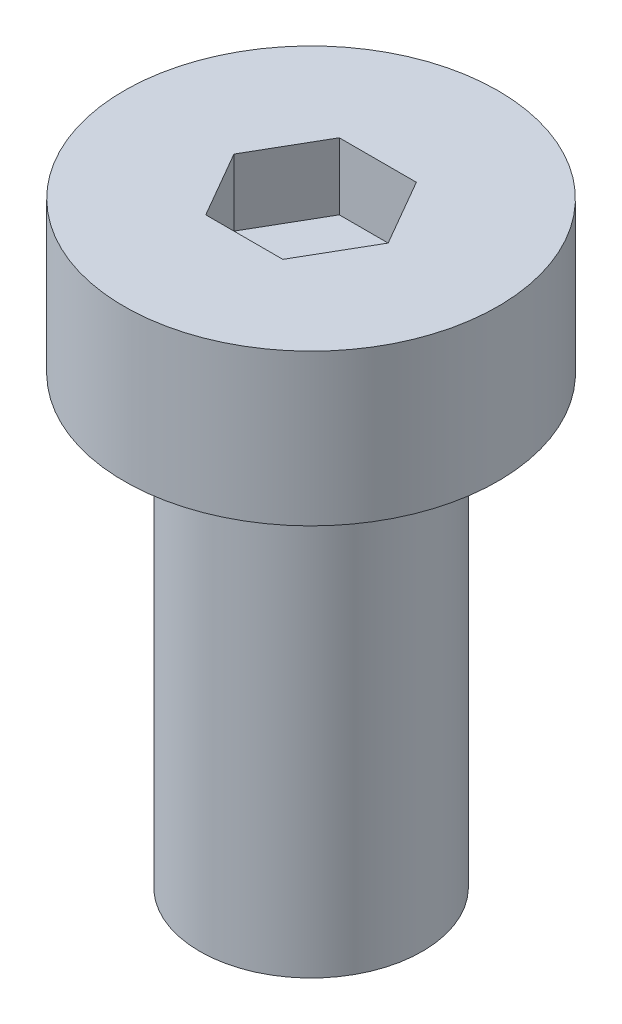
ISO-10303-21;
HEADER;
FILE_DESCRIPTION(('STEP AP214'),'2;1');
FILE_NAME('part.step','',(''),(''),'','','');
FILE_SCHEMA(('AUTOMOTIVE_DESIGN { 1 0 10303 214 1 1 1 1 }'));
ENDSEC;
DATA;
#1=APPLICATION_CONTEXT('core data for automotive mechanical design processes');
#2=APPLICATION_PROTOCOL_DEFINITION('international standard','automotive_design',2000,#1);
#3=PRODUCT_CONTEXT('',#1,'mechanical');
#4=PRODUCT('Part','Part','',(#3));
#5=PRODUCT_RELATED_PRODUCT_CATEGORY('part','',(#4));
#6=PRODUCT_DEFINITION_FORMATION('','',#4);
#7=PRODUCT_DEFINITION_CONTEXT('part definition',#1,'design');
#8=PRODUCT_DEFINITION('design','',#6,#7);
#9=PRODUCT_DEFINITION_SHAPE('','',#8);
#10=(LENGTH_UNIT() NAMED_UNIT(*) SI_UNIT(.MILLI.,.METRE.));
#11=(NAMED_UNIT(*) PLANE_ANGLE_UNIT() SI_UNIT($,.RADIAN.));
#12=(NAMED_UNIT(*) SI_UNIT($,.STERADIAN.) SOLID_ANGLE_UNIT());
#13=UNCERTAINTY_MEASURE_WITH_UNIT(LENGTH_MEASURE(1.E-05),#10,'distance_accuracy_value','');
#14=(GEOMETRIC_REPRESENTATION_CONTEXT(3) GLOBAL_UNCERTAINTY_ASSIGNED_CONTEXT((#13)) GLOBAL_UNIT_ASSIGNED_CONTEXT((#10,
#11,#12)) REPRESENTATION_CONTEXT('',''));
#15=CARTESIAN_POINT('',(0.,0.,0.));
#16=DIRECTION('',(0.,0.,1.));
#17=DIRECTION('',(1.,0.,0.));
#18=AXIS2_PLACEMENT_3D('',#15,#16,#17);
#19=CARTESIAN_POINT('',(0.,10.,0.));
#20=DIRECTION('',(0.,-1.,0.));
#21=DIRECTION('',(0.,0.,-1.));
#22=AXIS2_PLACEMENT_3D('',#19,#20,#21);
#23=CYLINDRICAL_SURFACE('',#22,2.5);
#24=CARTESIAN_POINT('',(0.,10.,0.));
#25=DIRECTION('',(0.,1.,0.));
#26=DIRECTION('',(0.,0.,1.));
#27=AXIS2_PLACEMENT_3D('',#24,#25,#26);
#28=CIRCLE('',#27,2.5);
#29=CARTESIAN_POINT('',(0.,10.,2.5));
#30=VERTEX_POINT('',#29);
#31=EDGE_CURVE('E11',#30,#30,#28,.T.);
#32=ORIENTED_EDGE('',*,*,#31,.F.);
#33=EDGE_LOOP('',(#32));
#34=FACE_BOUND('',#33,.T.);
#35=CARTESIAN_POINT('',(0.,0.,0.));
#36=DIRECTION('',(0.,1.,0.));
#37=DIRECTION('',(0.,0.,1.));
#38=AXIS2_PLACEMENT_3D('',#35,#36,#37);
#39=CIRCLE('',#38,2.5);
#40=CARTESIAN_POINT('',(0.,0.,2.5));
#41=VERTEX_POINT('',#40);
#42=EDGE_CURVE('E36',#41,#41,#39,.T.);
#43=ORIENTED_EDGE('',*,*,#42,.T.);
#44=EDGE_LOOP('',(#43));
#45=FACE_BOUND('',#44,.T.);
#46=ADVANCED_FACE('F33',(#34,#45),#23,.T.);
#47=CARTESIAN_POINT('',(0.,0.,0.));
#48=DIRECTION('',(0.,1.,0.));
#49=DIRECTION('',(0.,0.,1.));
#50=AXIS2_PLACEMENT_3D('',#47,#48,#49);
#51=PLANE('',#50);
#52=ORIENTED_EDGE('',*,*,#42,.F.);
#53=EDGE_LOOP('',(#52));
#54=FACE_BOUND('',#53,.T.);
#55=ADVANCED_FACE('F150',(#54),#51,.F.);
#56=CARTESIAN_POINT('',(-4.2,10.,0.));
#57=DIRECTION('',(0.,1.,0.));
#58=DIRECTION('',(0.,0.,1.));
#59=AXIS2_PLACEMENT_3D('',#56,#57,#58);
#60=PLANE('',#59);
#61=CARTESIAN_POINT('',(0.,10.,0.));
#62=DIRECTION('',(0.,-1.,0.));
#63=DIRECTION('',(0.,0.,-1.));
#64=AXIS2_PLACEMENT_3D('',#61,#62,#63);
#65=CIRCLE('',#64,4.2);
#66=CARTESIAN_POINT('',(0.,10.,-4.2));
#67=VERTEX_POINT('',#66);
#68=EDGE_CURVE('E134',#67,#67,#65,.T.);
#69=ORIENTED_EDGE('',*,*,#68,.T.);
#70=EDGE_LOOP('',(#69));
#71=FACE_BOUND('',#70,.T.);
#72=ORIENTED_EDGE('',*,*,#31,.T.);
#73=EDGE_LOOP('',(#72));
#74=FACE_BOUND('',#73,.T.);
#75=ADVANCED_FACE('F152',(#71,#74),#60,.F.);
#76=CARTESIAN_POINT('',(0.,10.,0.));
#77=DIRECTION('',(0.,-1.,0.));
#78=DIRECTION('',(0.,0.,-1.));
#79=AXIS2_PLACEMENT_3D('',#76,#77,#78);
#80=CYLINDRICAL_SURFACE('',#79,4.2);
#81=ORIENTED_EDGE('',*,*,#68,.F.);
#82=EDGE_LOOP('',(#81));
#83=FACE_BOUND('',#82,.T.);
#84=CARTESIAN_POINT('',(0.,13.4,0.));
#85=DIRECTION('',(0.,-1.,0.));
#86=DIRECTION('',(0.,0.,-1.));
#87=AXIS2_PLACEMENT_3D('',#84,#85,#86);
#88=CIRCLE('',#87,4.2);
#89=CARTESIAN_POINT('',(0.,13.4,-4.2));
#90=VERTEX_POINT('',#89);
#91=EDGE_CURVE('E142',#90,#90,#88,.T.);
#92=ORIENTED_EDGE('',*,*,#91,.T.);
#93=EDGE_LOOP('',(#92));
#94=FACE_BOUND('',#93,.T.);
#95=ADVANCED_FACE('F157',(#83,#94),#80,.T.);
#96=CARTESIAN_POINT('',(-4.2,13.4,0.));
#97=DIRECTION('',(0.,-1.,0.));
#98=DIRECTION('',(0.,0.,-1.));
#99=AXIS2_PLACEMENT_3D('',#96,#97,#98);
#100=PLANE('',#99);
#101=DIRECTION('',(-0.5,0.,-0.866025403784439));
#102=VECTOR('',#101,1.);
#103=CARTESIAN_POINT('',(1.73205080756888,13.4,0.));
#104=LINE('',#103,#102);
#105=CARTESIAN_POINT('',(1.73205080756888,13.4,0.));
#106=VERTEX_POINT('',#105);
#107=CARTESIAN_POINT('',(0.866025403784438,13.4,-1.5));
#108=VERTEX_POINT('',#107);
#109=EDGE_CURVE('E121',#106,#108,#104,.T.);
#110=ORIENTED_EDGE('',*,*,#109,.F.);
#111=DIRECTION('',(0.5,0.,-0.866025403784439));
#112=VECTOR('',#111,1.);
#113=CARTESIAN_POINT('',(0.866025403784439,13.4,1.5));
#114=LINE('',#113,#112);
#115=CARTESIAN_POINT('',(0.866025403784439,13.4,1.5));
#116=VERTEX_POINT('',#115);
#117=EDGE_CURVE('E47',#116,#106,#114,.T.);
#118=ORIENTED_EDGE('',*,*,#117,.F.);
#119=DIRECTION('',(1.,0.,0.));
#120=VECTOR('',#119,1.);
#121=CARTESIAN_POINT('',(-0.866025403784439,13.4,1.5));
#122=LINE('',#121,#120);
#123=CARTESIAN_POINT('',(-0.866025403784439,13.4,1.5));
#124=VERTEX_POINT('',#123);
#125=EDGE_CURVE('E130',#124,#116,#122,.T.);
#126=ORIENTED_EDGE('',*,*,#125,.F.);
#127=DIRECTION('',(0.5,0.,0.866025403784439));
#128=VECTOR('',#127,1.);
#129=CARTESIAN_POINT('',(-1.73205080756888,13.4,0.));
#130=LINE('',#129,#128);
#131=CARTESIAN_POINT('',(-1.73205080756888,13.4,0.));
#132=VERTEX_POINT('',#131);
#133=EDGE_CURVE('E128',#132,#124,#130,.T.);
#134=ORIENTED_EDGE('',*,*,#133,.F.);
#135=DIRECTION('',(-0.5,0.,0.866025403784439));
#136=VECTOR('',#135,1.);
#137=CARTESIAN_POINT('',(-0.866025403784439,13.4,-1.5));
#138=LINE('',#137,#136);
#139=CARTESIAN_POINT('',(-0.866025403784439,13.4,-1.5));
#140=VERTEX_POINT('',#139);
#141=EDGE_CURVE('E95',#140,#132,#138,.T.);
#142=ORIENTED_EDGE('',*,*,#141,.F.);
#143=DIRECTION('',(-1.,0.,0.));
#144=VECTOR('',#143,1.);
#145=CARTESIAN_POINT('',(0.866025403784438,13.4,-1.5));
#146=LINE('',#145,#144);
#147=EDGE_CURVE('E124',#108,#140,#146,.T.);
#148=ORIENTED_EDGE('',*,*,#147,.F.);
#149=EDGE_LOOP('',(#110,#118,#126,#134,#142,#148));
#150=FACE_BOUND('',#149,.T.);
#151=ORIENTED_EDGE('',*,*,#91,.F.);
#152=EDGE_LOOP('',(#151));
#153=FACE_BOUND('',#152,.T.);
#154=ADVANCED_FACE('F164',(#150,#153),#100,.F.);
#155=CARTESIAN_POINT('',(0.866025403784439,11.9,1.5));
#156=DIRECTION('',(0.866025403784439,0.,0.5));
#157=DIRECTION('',(0.5,0.,-0.866025403784439));
#158=AXIS2_PLACEMENT_3D('',#155,#156,#157);
#159=PLANE('',#158);
#160=ORIENTED_EDGE('',*,*,#117,.T.);
#161=DIRECTION('',(0.,1.,0.));
#162=VECTOR('',#161,1.);
#163=CARTESIAN_POINT('',(1.73205080756888,11.9,0.));
#164=LINE('',#163,#162);
#165=CARTESIAN_POINT('',(1.73205080756888,11.9,0.));
#166=VERTEX_POINT('',#165);
#167=EDGE_CURVE('E77',#166,#106,#164,.T.);
#168=ORIENTED_EDGE('',*,*,#167,.F.);
#169=DIRECTION('',(0.5,0.,-0.866025403784439));
#170=VECTOR('',#169,1.);
#171=CARTESIAN_POINT('',(0.866025403784439,11.9,1.5));
#172=LINE('',#171,#170);
#173=CARTESIAN_POINT('',(0.866025403784439,11.9,1.5));
#174=VERTEX_POINT('',#173);
#175=EDGE_CURVE('E132',#174,#166,#172,.T.);
#176=ORIENTED_EDGE('',*,*,#175,.F.);
#177=DIRECTION('',(0.,1.,0.));
#178=VECTOR('',#177,1.);
#179=CARTESIAN_POINT('',(0.866025403784439,11.9,1.5));
#180=LINE('',#179,#178);
#181=EDGE_CURVE('E55',#174,#116,#180,.T.);
#182=ORIENTED_EDGE('',*,*,#181,.T.);
#183=EDGE_LOOP('',(#160,#168,#176,#182));
#184=FACE_BOUND('',#183,.T.);
#185=ADVANCED_FACE('F167',(#184),#159,.F.);
#186=CARTESIAN_POINT('',(-0.866025403784439,11.9,1.5));
#187=DIRECTION('',(0.,0.,1.));
#188=DIRECTION('',(1.,0.,0.));
#189=AXIS2_PLACEMENT_3D('',#186,#187,#188);
#190=PLANE('',#189);
#191=ORIENTED_EDGE('',*,*,#125,.T.);
#192=ORIENTED_EDGE('',*,*,#181,.F.);
#193=DIRECTION('',(1.,0.,0.));
#194=VECTOR('',#193,1.);
#195=CARTESIAN_POINT('',(-0.866025403784439,11.9,1.5));
#196=LINE('',#195,#194);
#197=CARTESIAN_POINT('',(-0.866025403784439,11.9,1.5));
#198=VERTEX_POINT('',#197);
#199=EDGE_CURVE('E107',#198,#174,#196,.T.);
#200=ORIENTED_EDGE('',*,*,#199,.F.);
#201=DIRECTION('',(0.,1.,0.));
#202=VECTOR('',#201,1.);
#203=CARTESIAN_POINT('',(-0.866025403784439,11.9,1.5));
#204=LINE('',#203,#202);
#205=EDGE_CURVE('E99',#198,#124,#204,.T.);
#206=ORIENTED_EDGE('',*,*,#205,.T.);
#207=EDGE_LOOP('',(#191,#192,#200,#206));
#208=FACE_BOUND('',#207,.T.);
#209=ADVANCED_FACE('F172',(#208),#190,.F.);
#210=CARTESIAN_POINT('',(-1.73205080756888,11.9,0.));
#211=DIRECTION('',(-0.866025403784438,0.,0.5));
#212=DIRECTION('',(0.5,0.,0.866025403784439));
#213=AXIS2_PLACEMENT_3D('',#210,#211,#212);
#214=PLANE('',#213);
#215=ORIENTED_EDGE('',*,*,#133,.T.);
#216=ORIENTED_EDGE('',*,*,#205,.F.);
#217=DIRECTION('',(0.5,0.,0.866025403784439));
#218=VECTOR('',#217,1.);
#219=CARTESIAN_POINT('',(-1.73205080756888,11.9,0.));
#220=LINE('',#219,#218);
#221=CARTESIAN_POINT('',(-1.73205080756888,11.9,0.));
#222=VERTEX_POINT('',#221);
#223=EDGE_CURVE('E103',#222,#198,#220,.T.);
#224=ORIENTED_EDGE('',*,*,#223,.F.);
#225=DIRECTION('',(0.,1.,0.));
#226=VECTOR('',#225,1.);
#227=CARTESIAN_POINT('',(-1.73205080756888,11.9,0.));
#228=LINE('',#227,#226);
#229=EDGE_CURVE('E88',#222,#132,#228,.T.);
#230=ORIENTED_EDGE('',*,*,#229,.T.);
#231=EDGE_LOOP('',(#215,#216,#224,#230));
#232=FACE_BOUND('',#231,.T.);
#233=ADVANCED_FACE('F104',(#232),#214,.F.);
#234=CARTESIAN_POINT('',(-0.866025403784439,11.9,-1.5));
#235=DIRECTION('',(-0.866025403784439,0.,-0.5));
#236=DIRECTION('',(-0.5,0.,0.866025403784439));
#237=AXIS2_PLACEMENT_3D('',#234,#235,#236);
#238=PLANE('',#237);
#239=ORIENTED_EDGE('',*,*,#141,.T.);
#240=ORIENTED_EDGE('',*,*,#229,.F.);
#241=DIRECTION('',(-0.5,0.,0.866025403784439));
#242=VECTOR('',#241,1.);
#243=CARTESIAN_POINT('',(-0.866025403784439,11.9,-1.5));
#244=LINE('',#243,#242);
#245=CARTESIAN_POINT('',(-0.866025403784439,11.9,-1.5));
#246=VERTEX_POINT('',#245);
#247=EDGE_CURVE('E92',#246,#222,#244,.T.);
#248=ORIENTED_EDGE('',*,*,#247,.F.);
#249=DIRECTION('',(0.,1.,0.));
#250=VECTOR('',#249,1.);
#251=CARTESIAN_POINT('',(-0.866025403784439,11.9,-1.5));
#252=LINE('',#251,#250);
#253=EDGE_CURVE('E100',#246,#140,#252,.T.);
#254=ORIENTED_EDGE('',*,*,#253,.T.);
#255=EDGE_LOOP('',(#239,#240,#248,#254));
#256=FACE_BOUND('',#255,.T.);
#257=ADVANCED_FACE('F90',(#256),#238,.F.);
#258=CARTESIAN_POINT('',(0.866025403784438,11.9,-1.5));
#259=DIRECTION('',(0.,0.,-1.));
#260=DIRECTION('',(-1.,0.,0.));
#261=AXIS2_PLACEMENT_3D('',#258,#259,#260);
#262=PLANE('',#261);
#263=ORIENTED_EDGE('',*,*,#147,.T.);
#264=ORIENTED_EDGE('',*,*,#253,.F.);
#265=DIRECTION('',(-1.,0.,0.));
#266=VECTOR('',#265,1.);
#267=CARTESIAN_POINT('',(0.866025403784438,11.9,-1.5));
#268=LINE('',#267,#266);
#269=CARTESIAN_POINT('',(0.866025403784438,11.9,-1.5));
#270=VERTEX_POINT('',#269);
#271=EDGE_CURVE('E113',#270,#246,#268,.T.);
#272=ORIENTED_EDGE('',*,*,#271,.F.);
#273=DIRECTION('',(0.,1.,0.));
#274=VECTOR('',#273,1.);
#275=CARTESIAN_POINT('',(0.866025403784438,11.9,-1.5));
#276=LINE('',#275,#274);
#277=EDGE_CURVE('E137',#270,#108,#276,.T.);
#278=ORIENTED_EDGE('',*,*,#277,.T.);
#279=EDGE_LOOP('',(#263,#264,#272,#278));
#280=FACE_BOUND('',#279,.T.);
#281=ADVANCED_FACE('F176',(#280),#262,.F.);
#282=CARTESIAN_POINT('',(1.73205080756888,11.9,0.));
#283=DIRECTION('',(0.866025403784438,0.,-0.5));
#284=DIRECTION('',(-0.5,0.,-0.866025403784439));
#285=AXIS2_PLACEMENT_3D('',#282,#283,#284);
#286=PLANE('',#285);
#287=ORIENTED_EDGE('',*,*,#109,.T.);
#288=ORIENTED_EDGE('',*,*,#277,.F.);
#289=DIRECTION('',(-0.5,0.,-0.866025403784439));
#290=VECTOR('',#289,1.);
#291=CARTESIAN_POINT('',(1.73205080756888,11.9,0.));
#292=LINE('',#291,#290);
#293=EDGE_CURVE('E115',#166,#270,#292,.T.);
#294=ORIENTED_EDGE('',*,*,#293,.F.);
#295=ORIENTED_EDGE('',*,*,#167,.T.);
#296=EDGE_LOOP('',(#287,#288,#294,#295));
#297=FACE_BOUND('',#296,.T.);
#298=ADVANCED_FACE('F173',(#297),#286,.F.);
#299=CARTESIAN_POINT('',(0.,11.9,0.));
#300=DIRECTION('',(0.,1.,0.));
#301=DIRECTION('',(0.,0.,1.));
#302=AXIS2_PLACEMENT_3D('',#299,#300,#301);
#303=PLANE('',#302);
#304=ORIENTED_EDGE('',*,*,#175,.T.);
#305=ORIENTED_EDGE('',*,*,#293,.T.);
#306=ORIENTED_EDGE('',*,*,#271,.T.);
#307=ORIENTED_EDGE('',*,*,#247,.T.);
#308=ORIENTED_EDGE('',*,*,#223,.T.);
#309=ORIENTED_EDGE('',*,*,#199,.T.);
#310=EDGE_LOOP('',(#304,#305,#306,#307,#308,#309));
#311=FACE_BOUND('',#310,.T.);
#312=ADVANCED_FACE('F110',(#311),#303,.T.);
#313=CLOSED_SHELL('',(#46,#55,#75,#95,#154,#185,#209,#233,#257,#281,#298,#312));
#314=MANIFOLD_SOLID_BREP('B2',#313);
#315=ADVANCED_BREP_SHAPE_REPRESENTATION('',(#18,#314),#14);
#316=SHAPE_DEFINITION_REPRESENTATION(#9,#315);
ENDSEC;
END-ISO-10303-21;
